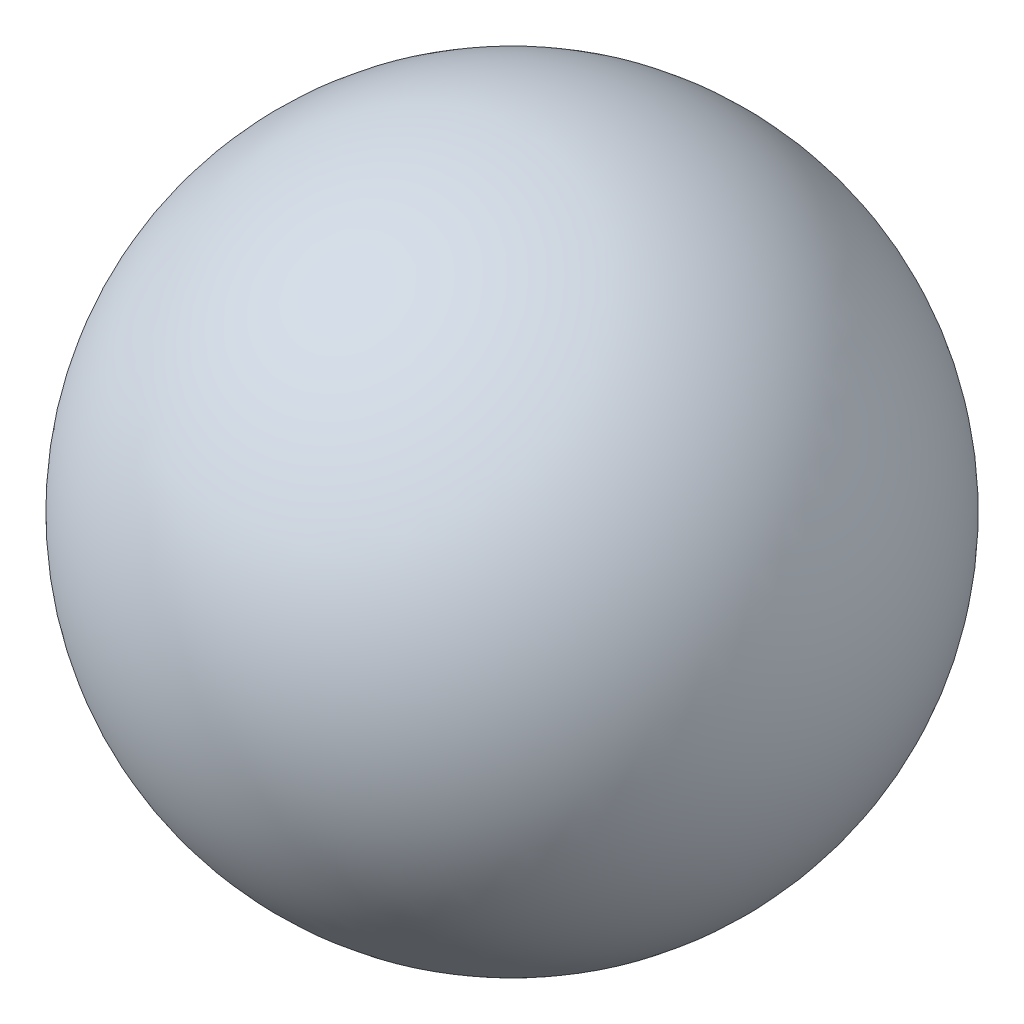
ISO-10303-21;
HEADER;
FILE_DESCRIPTION(('STEP AP214'),'2;1');
FILE_NAME('part.step','',(''),(''),'','','');
FILE_SCHEMA(('AUTOMOTIVE_DESIGN { 1 0 10303 214 1 1 1 1 }'));
ENDSEC;
DATA;
#1=APPLICATION_CONTEXT('core data for automotive mechanical design processes');
#2=APPLICATION_PROTOCOL_DEFINITION('international standard','automotive_design',2000,#1);
#3=PRODUCT_CONTEXT('',#1,'mechanical');
#4=PRODUCT('Part','Part','',(#3));
#5=PRODUCT_RELATED_PRODUCT_CATEGORY('part','',(#4));
#6=PRODUCT_DEFINITION_FORMATION('','',#4);
#7=PRODUCT_DEFINITION_CONTEXT('part definition',#1,'design');
#8=PRODUCT_DEFINITION('design','',#6,#7);
#9=PRODUCT_DEFINITION_SHAPE('','',#8);
#10=(LENGTH_UNIT() NAMED_UNIT(*) SI_UNIT(.MILLI.,.METRE.));
#11=(NAMED_UNIT(*) PLANE_ANGLE_UNIT() SI_UNIT($,.RADIAN.));
#12=(NAMED_UNIT(*) SI_UNIT($,.STERADIAN.) SOLID_ANGLE_UNIT());
#13=UNCERTAINTY_MEASURE_WITH_UNIT(LENGTH_MEASURE(1.E-05),#10,'distance_accuracy_value','');
#14=(GEOMETRIC_REPRESENTATION_CONTEXT(3) GLOBAL_UNCERTAINTY_ASSIGNED_CONTEXT((#13)) GLOBAL_UNIT_ASSIGNED_CONTEXT((#10,
#11,#12)) REPRESENTATION_CONTEXT('',''));
#15=CARTESIAN_POINT('',(0.,0.,0.));
#16=DIRECTION('',(0.,0.,1.));
#17=DIRECTION('',(1.,0.,0.));
#18=AXIS2_PLACEMENT_3D('',#15,#16,#17);
#19=CARTESIAN_POINT('',(0.,0.,0.));
#20=DIRECTION('',(0.,1.,0.));
#21=DIRECTION('',(1.,0.,0.));
#22=AXIS2_PLACEMENT_3D('',#19,#20,#21);
#23=SPHERICAL_SURFACE('',#22,2.75);
#24=CARTESIAN_POINT('',(0.,2.75,0.));
#25=VERTEX_POINT('',#24);
#26=VERTEX_LOOP('',#25);
#27=FACE_BOUND('',#26,.T.);
#28=ADVANCED_FACE('F33',(#27),#23,.T.);
#29=CLOSED_SHELL('',(#28));
#30=MANIFOLD_SOLID_BREP('B2',#29);
#31=ADVANCED_BREP_SHAPE_REPRESENTATION('',(#18,#30),#14);
#32=SHAPE_DEFINITION_REPRESENTATION(#9,#31);
ENDSEC;
END-ISO-10303-21;
